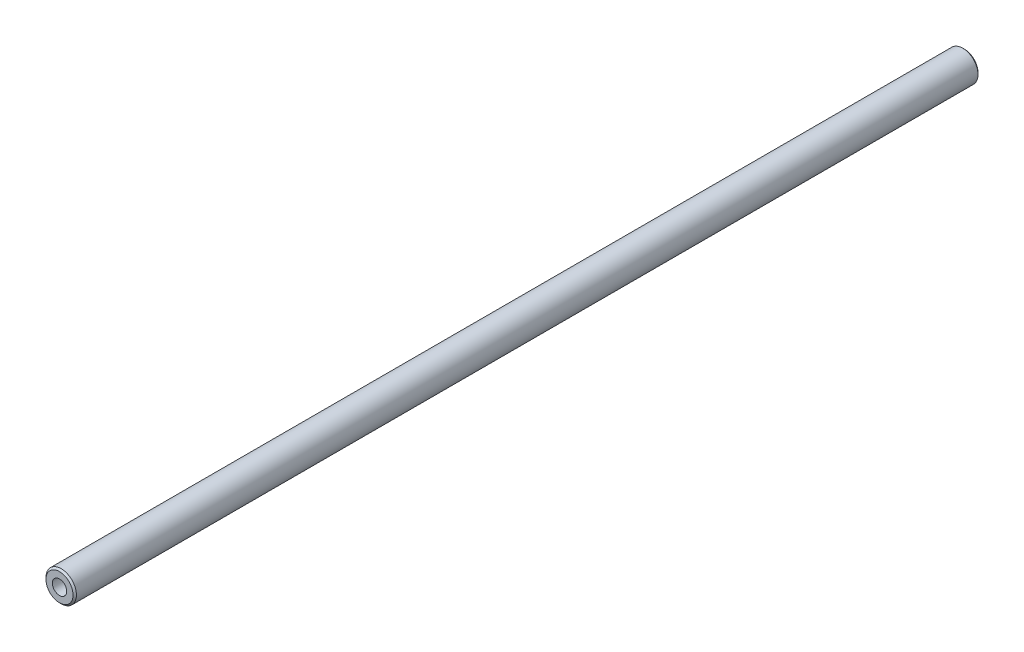
ISO-10303-21;
HEADER;
FILE_DESCRIPTION(('STEP AP214'),'2;1');
FILE_NAME('part.step','',(''),(''),'','','');
FILE_SCHEMA(('AUTOMOTIVE_DESIGN { 1 0 10303 214 1 1 1 1 }'));
ENDSEC;
DATA;
#1=APPLICATION_CONTEXT('core data for automotive mechanical design processes');
#2=APPLICATION_PROTOCOL_DEFINITION('international standard','automotive_design',2000,#1);
#3=PRODUCT_CONTEXT('',#1,'mechanical');
#4=PRODUCT('Part','Part','',(#3));
#5=PRODUCT_RELATED_PRODUCT_CATEGORY('part','',(#4));
#6=PRODUCT_DEFINITION_FORMATION('','',#4);
#7=PRODUCT_DEFINITION_CONTEXT('part definition',#1,'design');
#8=PRODUCT_DEFINITION('design','',#6,#7);
#9=PRODUCT_DEFINITION_SHAPE('','',#8);
#10=(LENGTH_UNIT() NAMED_UNIT(*) SI_UNIT(.MILLI.,.METRE.));
#11=(NAMED_UNIT(*) PLANE_ANGLE_UNIT() SI_UNIT($,.RADIAN.));
#12=(NAMED_UNIT(*) SI_UNIT($,.STERADIAN.) SOLID_ANGLE_UNIT());
#13=UNCERTAINTY_MEASURE_WITH_UNIT(LENGTH_MEASURE(1.E-05),#10,'distance_accuracy_value','');
#14=(GEOMETRIC_REPRESENTATION_CONTEXT(3) GLOBAL_UNCERTAINTY_ASSIGNED_CONTEXT((#13)) GLOBAL_UNIT_ASSIGNED_CONTEXT((#10,
#11,#12)) REPRESENTATION_CONTEXT('',''));
#15=CARTESIAN_POINT('',(0.,0.,0.));
#16=DIRECTION('',(0.,0.,1.));
#17=DIRECTION('',(1.,0.,0.));
#18=AXIS2_PLACEMENT_3D('',#15,#16,#17);
#19=CARTESIAN_POINT('',(0.,0.,267.5));
#20=DIRECTION('',(0.,0.,-1.));
#21=DIRECTION('',(-1.,0.,0.));
#22=AXIS2_PLACEMENT_3D('',#19,#20,#21);
#23=CYLINDRICAL_SURFACE('',#22,9.);
#24=CARTESIAN_POINT('',(0.,0.,266.5));
#25=DIRECTION('',(0.,0.,1.));
#26=DIRECTION('',(1.,0.,0.));
#27=AXIS2_PLACEMENT_3D('',#24,#25,#26);
#28=CIRCLE('',#27,9.);
#29=CARTESIAN_POINT('',(8.99999999999998,0.,266.5));
#30=VERTEX_POINT('',#29);
#31=EDGE_CURVE('E49',#30,#30,#28,.F.);
#32=ORIENTED_EDGE('',*,*,#31,.T.);
#33=EDGE_LOOP('',(#32));
#34=FACE_BOUND('',#33,.T.);
#35=CARTESIAN_POINT('',(0.,0.,-266.5));
#36=DIRECTION('',(0.,0.,1.));
#37=DIRECTION('',(1.,0.,0.));
#38=AXIS2_PLACEMENT_3D('',#35,#36,#37);
#39=CIRCLE('',#38,9.);
#40=CARTESIAN_POINT('',(9.00000000000002,0.,-266.5));
#41=VERTEX_POINT('',#40);
#42=EDGE_CURVE('E69',#41,#41,#39,.T.);
#43=ORIENTED_EDGE('',*,*,#42,.T.);
#44=EDGE_LOOP('',(#43));
#45=FACE_BOUND('',#44,.T.);
#46=ADVANCED_FACE('F42',(#34,#45),#23,.T.);
#47=CARTESIAN_POINT('',(0.,0.,267.5));
#48=DIRECTION('',(0.,0.,1.));
#49=DIRECTION('',(1.,0.,0.));
#50=AXIS2_PLACEMENT_3D('',#47,#48,#49);
#51=PLANE('',#50);
#52=CARTESIAN_POINT('',(0.,0.,267.5));
#53=DIRECTION('',(0.,0.,1.));
#54=DIRECTION('',(1.,0.,0.));
#55=AXIS2_PLACEMENT_3D('',#52,#53,#54);
#56=CIRCLE('',#55,4.24999999999999);
#57=CARTESIAN_POINT('',(4.24999999999997,0.,267.5));
#58=VERTEX_POINT('',#57);
#59=EDGE_CURVE('E61',#58,#58,#56,.T.);
#60=ORIENTED_EDGE('',*,*,#59,.F.);
#61=EDGE_LOOP('',(#60));
#62=FACE_BOUND('',#61,.T.);
#63=CARTESIAN_POINT('',(0.,0.,267.5));
#64=DIRECTION('',(0.,0.,1.));
#65=DIRECTION('',(1.,0.,0.));
#66=AXIS2_PLACEMENT_3D('',#63,#64,#65);
#67=CIRCLE('',#66,7.99999999999999);
#68=CARTESIAN_POINT('',(7.99999999999997,0.,267.5));
#69=VERTEX_POINT('',#68);
#70=EDGE_CURVE('E64',#69,#69,#67,.T.);
#71=ORIENTED_EDGE('',*,*,#70,.T.);
#72=EDGE_LOOP('',(#71));
#73=FACE_BOUND('',#72,.T.);
#74=ADVANCED_FACE('F82',(#62,#73),#51,.T.);
#75=CARTESIAN_POINT('',(0.,0.,-267.5));
#76=DIRECTION('',(0.,0.,1.));
#77=DIRECTION('',(1.,0.,0.));
#78=AXIS2_PLACEMENT_3D('',#75,#76,#77);
#79=PLANE('',#78);
#80=CARTESIAN_POINT('',(0.,0.,-267.5));
#81=DIRECTION('',(0.,0.,1.));
#82=DIRECTION('',(1.,0.,0.));
#83=AXIS2_PLACEMENT_3D('',#80,#81,#82);
#84=CIRCLE('',#83,7.99999999999999);
#85=CARTESIAN_POINT('',(8.00000000000002,0.,-267.5));
#86=VERTEX_POINT('',#85);
#87=EDGE_CURVE('E11',#86,#86,#84,.F.);
#88=ORIENTED_EDGE('',*,*,#87,.T.);
#89=EDGE_LOOP('',(#88));
#90=FACE_BOUND('',#89,.T.);
#91=ADVANCED_FACE('F79',(#90),#79,.F.);
#92=CARTESIAN_POINT('',(0.,0.,267.5));
#93=DIRECTION('',(0.,0.,-1.));
#94=DIRECTION('',(-1.,0.,0.));
#95=AXIS2_PLACEMENT_3D('',#92,#93,#94);
#96=CONICAL_SURFACE('',#95,7.99999999999999,0.785398163397452);
#97=ORIENTED_EDGE('',*,*,#31,.F.);
#98=EDGE_LOOP('',(#97));
#99=FACE_BOUND('',#98,.T.);
#100=ORIENTED_EDGE('',*,*,#70,.F.);
#101=EDGE_LOOP('',(#100));
#102=FACE_BOUND('',#101,.T.);
#103=ADVANCED_FACE('F76',(#99,#102),#96,.T.);
#104=CARTESIAN_POINT('',(0.,0.,-266.5));
#105=DIRECTION('',(0.,0.,1.));
#106=DIRECTION('',(1.,0.,0.));
#107=AXIS2_PLACEMENT_3D('',#104,#105,#106);
#108=CONICAL_SURFACE('',#107,9.,0.785398163397452);
#109=ORIENTED_EDGE('',*,*,#87,.F.);
#110=EDGE_LOOP('',(#109));
#111=FACE_BOUND('',#110,.T.);
#112=ORIENTED_EDGE('',*,*,#42,.F.);
#113=EDGE_LOOP('',(#112));
#114=FACE_BOUND('',#113,.T.);
#115=ADVANCED_FACE('F44',(#111,#114),#108,.T.);
#116=CARTESIAN_POINT('',(0.,0.,267.5));
#117=DIRECTION('',(0.,0.,1.));
#118=DIRECTION('',(1.,0.,0.));
#119=AXIS2_PLACEMENT_3D('',#116,#117,#118);
#120=CYLINDRICAL_SURFACE('',#119,4.24999999999999);
#121=CARTESIAN_POINT('',(0.,0.,244.5));
#122=DIRECTION('',(0.,0.,1.));
#123=DIRECTION('',(1.,0.,0.));
#124=AXIS2_PLACEMENT_3D('',#121,#122,#123);
#125=CIRCLE('',#124,4.24999999999999);
#126=CARTESIAN_POINT('',(4.24999999999997,0.,244.5));
#127=VERTEX_POINT('',#126);
#128=EDGE_CURVE('E59',#127,#127,#125,.T.);
#129=ORIENTED_EDGE('',*,*,#128,.F.);
#130=EDGE_LOOP('',(#129));
#131=FACE_BOUND('',#130,.T.);
#132=ORIENTED_EDGE('',*,*,#59,.T.);
#133=EDGE_LOOP('',(#132));
#134=FACE_BOUND('',#133,.T.);
#135=ADVANCED_FACE('F55',(#131,#134),#120,.F.);
#136=CARTESIAN_POINT('',(0.,0.,244.5));
#137=DIRECTION('',(0.,0.,1.));
#138=DIRECTION('',(1.,0.,0.));
#139=AXIS2_PLACEMENT_3D('',#136,#137,#138);
#140=CONICAL_SURFACE('',#139,4.24999999999999,1.02974425867665);
#141=CARTESIAN_POINT('',(0.,0.,241.946342369133));
#142=VERTEX_POINT('',#141);
#143=VERTEX_LOOP('',#142);
#144=FACE_BOUND('',#143,.T.);
#145=ORIENTED_EDGE('',*,*,#128,.T.);
#146=EDGE_LOOP('',(#145));
#147=FACE_BOUND('',#146,.T.);
#148=ADVANCED_FACE('F52',(#144,#147),#140,.F.);
#149=CLOSED_SHELL('',(#46,#74,#91,#103,#115,#135,#148));
#150=MANIFOLD_SOLID_BREP('B2',#149);
#151=ADVANCED_BREP_SHAPE_REPRESENTATION('',(#18,#150),#14);
#152=SHAPE_DEFINITION_REPRESENTATION(#9,#151);
ENDSEC;
END-ISO-10303-21;
